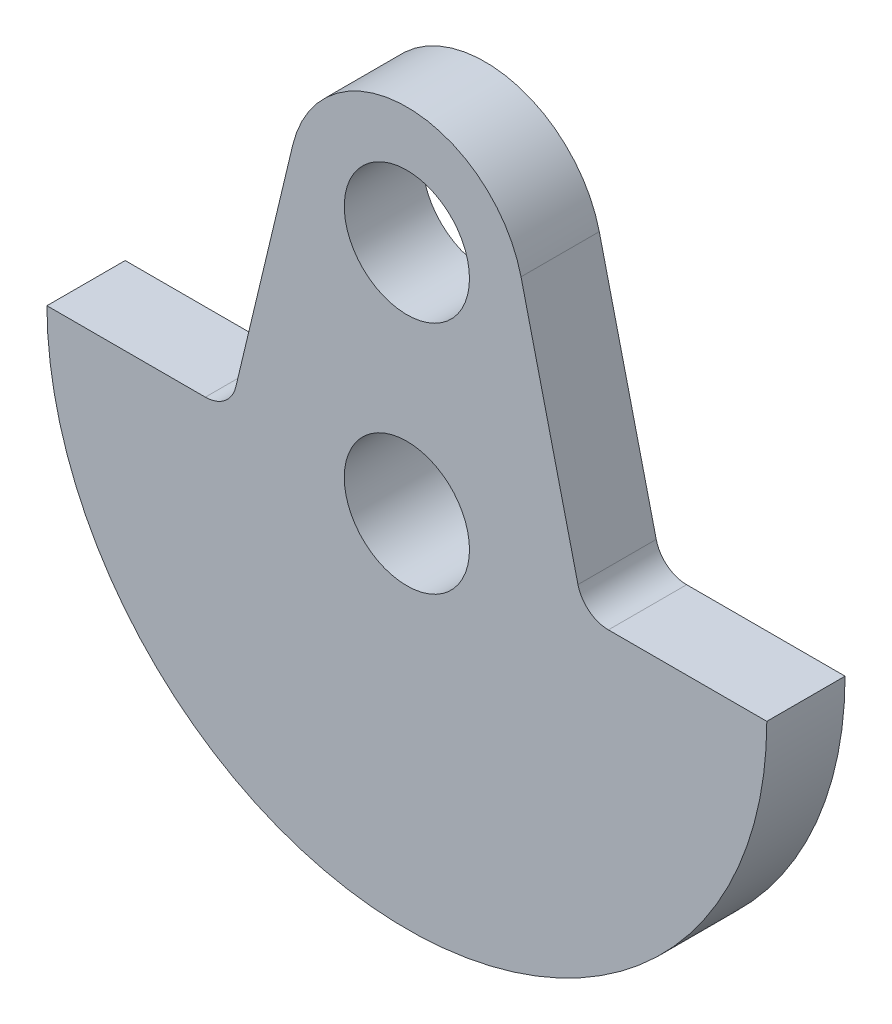
ISO-10303-21;
HEADER;
FILE_DESCRIPTION(('STEP AP214'),'2;1');
FILE_NAME('part.step','',(''),(''),'','','');
FILE_SCHEMA(('AUTOMOTIVE_DESIGN { 1 0 10303 214 1 1 1 1 }'));
ENDSEC;
DATA;
#1=APPLICATION_CONTEXT('core data for automotive mechanical design processes');
#2=APPLICATION_PROTOCOL_DEFINITION('international standard','automotive_design',2000,#1);
#3=PRODUCT_CONTEXT('',#1,'mechanical');
#4=PRODUCT('Part','Part','',(#3));
#5=PRODUCT_RELATED_PRODUCT_CATEGORY('part','',(#4));
#6=PRODUCT_DEFINITION_FORMATION('','',#4);
#7=PRODUCT_DEFINITION_CONTEXT('part definition',#1,'design');
#8=PRODUCT_DEFINITION('design','',#6,#7);
#9=PRODUCT_DEFINITION_SHAPE('','',#8);
#10=(LENGTH_UNIT() NAMED_UNIT(*) SI_UNIT(.MILLI.,.METRE.));
#11=(NAMED_UNIT(*) PLANE_ANGLE_UNIT() SI_UNIT($,.RADIAN.));
#12=(NAMED_UNIT(*) SI_UNIT($,.STERADIAN.) SOLID_ANGLE_UNIT());
#13=UNCERTAINTY_MEASURE_WITH_UNIT(LENGTH_MEASURE(1.E-05),#10,'distance_accuracy_value','');
#14=(GEOMETRIC_REPRESENTATION_CONTEXT(3) GLOBAL_UNCERTAINTY_ASSIGNED_CONTEXT((#13)) GLOBAL_UNIT_ASSIGNED_CONTEXT((#10,
#11,#12)) REPRESENTATION_CONTEXT('',''));
#15=CARTESIAN_POINT('',(0.,0.,0.));
#16=DIRECTION('',(0.,0.,1.));
#17=DIRECTION('',(1.,0.,0.));
#18=AXIS2_PLACEMENT_3D('',#15,#16,#17);
#19=CARTESIAN_POINT('',(12.8779821402295,-13.,0.));
#20=DIRECTION('',(0.,0.,1.));
#21=DIRECTION('',(1.,0.,0.));
#22=AXIS2_PLACEMENT_3D('',#19,#20,#21);
#23=PLANE('',#22);
#24=CARTESIAN_POINT('',(0.,0.,0.));
#25=DIRECTION('',(0.,0.,1.));
#26=DIRECTION('',(1.,0.,0.));
#27=AXIS2_PLACEMENT_3D('',#24,#25,#26);
#28=CIRCLE('',#27,4.);
#29=CARTESIAN_POINT('',(4.,0.,0.));
#30=VERTEX_POINT('',#29);
#31=EDGE_CURVE('E219',#30,#30,#28,.T.);
#32=ORIENTED_EDGE('',*,*,#31,.T.);
#33=EDGE_LOOP('',(#32));
#34=FACE_BOUND('',#33,.T.);
#35=CARTESIAN_POINT('',(12.8779821402295,-13.,0.));
#36=DIRECTION('',(0.,0.,-1.));
#37=DIRECTION('',(1.,0.,0.));
#38=AXIS2_PLACEMENT_3D('',#35,#36,#37);
#39=CIRCLE('',#38,2.);
#40=CARTESIAN_POINT('',(12.8779821402295,-15.,0.));
#41=VERTEX_POINT('',#40);
#42=CARTESIAN_POINT('',(10.9328660587534,-13.4653207813787,0.));
#43=VERTEX_POINT('',#42);
#44=EDGE_CURVE('E147',#41,#43,#39,.T.);
#45=ORIENTED_EDGE('',*,*,#44,.F.);
#46=DIRECTION('',(-1.,0.,0.));
#47=VECTOR('',#46,1.);
#48=CARTESIAN_POINT('',(12.8779821402295,-15.,0.));
#49=LINE('',#48,#47);
#50=CARTESIAN_POINT('',(23.,-15.,0.));
#51=VERTEX_POINT('',#50);
#52=EDGE_CURVE('E96',#51,#41,#49,.T.);
#53=ORIENTED_EDGE('',*,*,#52,.F.);
#54=CARTESIAN_POINT('',(0.,-15.,0.));
#55=DIRECTION('',(0.,0.,1.));
#56=DIRECTION('',(1.,0.,0.));
#57=AXIS2_PLACEMENT_3D('',#54,#55,#56);
#58=CIRCLE('',#57,23.);
#59=CARTESIAN_POINT('',(-23.,-15.,0.));
#60=VERTEX_POINT('',#59);
#61=EDGE_CURVE('E90',#60,#51,#58,.T.);
#62=ORIENTED_EDGE('',*,*,#61,.F.);
#63=DIRECTION('',(-1.,0.,0.));
#64=VECTOR('',#63,1.);
#65=CARTESIAN_POINT('',(-23.,-15.,0.));
#66=LINE('',#65,#64);
#67=CARTESIAN_POINT('',(-12.8779821402295,-15.,0.));
#68=VERTEX_POINT('',#67);
#69=EDGE_CURVE('E134',#68,#60,#66,.T.);
#70=ORIENTED_EDGE('',*,*,#69,.F.);
#71=CARTESIAN_POINT('',(-12.8779821402295,-13.,0.));
#72=DIRECTION('',(0.,0.,-1.));
#73=DIRECTION('',(-1.,0.,0.));
#74=AXIS2_PLACEMENT_3D('',#71,#72,#73);
#75=CIRCLE('',#74,2.);
#76=CARTESIAN_POINT('',(-10.9328660587534,-13.4653207813787,0.));
#77=VERTEX_POINT('',#76);
#78=EDGE_CURVE('E161',#77,#68,#75,.T.);
#79=ORIENTED_EDGE('',*,*,#78,.F.);
#80=DIRECTION('',(-0.232660390689349,-0.972558040738073,0.));
#81=VECTOR('',#80,1.);
#82=CARTESIAN_POINT('',(-10.9328660587534,-13.4653207813787,0.));
#83=LINE('',#82,#81);
#84=CARTESIAN_POINT('',(-7.29418530553555,1.74495293017012,0.));
#85=VERTEX_POINT('',#84);
#86=EDGE_CURVE('E158',#85,#77,#83,.T.);
#87=ORIENTED_EDGE('',*,*,#86,.F.);
#88=CARTESIAN_POINT('',(0.,0.,0.));
#89=DIRECTION('',(0.,0.,1.));
#90=DIRECTION('',(1.,0.,0.));
#91=AXIS2_PLACEMENT_3D('',#88,#89,#90);
#92=CIRCLE('',#91,7.5);
#93=CARTESIAN_POINT('',(7.29418530553555,1.74495293017011,0.));
#94=VERTEX_POINT('',#93);
#95=EDGE_CURVE('E155',#94,#85,#92,.T.);
#96=ORIENTED_EDGE('',*,*,#95,.F.);
#97=DIRECTION('',(-0.232660390689349,0.972558040738073,0.));
#98=VECTOR('',#97,1.);
#99=CARTESIAN_POINT('',(10.9328660587534,-13.4653207813787,0.));
#100=LINE('',#99,#98);
#101=EDGE_CURVE('E151',#43,#94,#100,.T.);
#102=ORIENTED_EDGE('',*,*,#101,.F.);
#103=EDGE_LOOP('',(#45,#53,#62,#70,#79,#87,#96,#102));
#104=FACE_BOUND('',#103,.T.);
#105=CARTESIAN_POINT('',(0.,-15.,0.));
#106=DIRECTION('',(0.,0.,1.));
#107=DIRECTION('',(1.,0.,0.));
#108=AXIS2_PLACEMENT_3D('',#105,#106,#107);
#109=CIRCLE('',#108,6.);
#110=CARTESIAN_POINT('',(6.,-15.,0.));
#111=VERTEX_POINT('',#110);
#112=EDGE_CURVE('E11',#111,#111,#109,.F.);
#113=ORIENTED_EDGE('',*,*,#112,.F.);
#114=EDGE_LOOP('',(#113));
#115=FACE_BOUND('',#114,.T.);
#116=ADVANCED_FACE('F43',(#34,#104,#115),#23,.F.);
#117=CARTESIAN_POINT('',(12.8779821402295,-13.,5.));
#118=DIRECTION('',(0.,0.,1.));
#119=DIRECTION('',(1.,0.,0.));
#120=AXIS2_PLACEMENT_3D('',#117,#118,#119);
#121=PLANE('',#120);
#122=CARTESIAN_POINT('',(0.,0.,5.));
#123=DIRECTION('',(0.,0.,1.));
#124=DIRECTION('',(1.,0.,0.));
#125=AXIS2_PLACEMENT_3D('',#122,#123,#124);
#126=CIRCLE('',#125,4.);
#127=CARTESIAN_POINT('',(4.,0.,5.));
#128=VERTEX_POINT('',#127);
#129=EDGE_CURVE('E152',#128,#128,#126,.T.);
#130=ORIENTED_EDGE('',*,*,#129,.F.);
#131=EDGE_LOOP('',(#130));
#132=FACE_BOUND('',#131,.T.);
#133=CARTESIAN_POINT('',(12.8779821402295,-13.,5.));
#134=DIRECTION('',(0.,0.,-1.));
#135=DIRECTION('',(1.,0.,0.));
#136=AXIS2_PLACEMENT_3D('',#133,#134,#135);
#137=CIRCLE('',#136,2.);
#138=CARTESIAN_POINT('',(12.8779821402295,-15.,5.));
#139=VERTEX_POINT('',#138);
#140=CARTESIAN_POINT('',(10.9328660587534,-13.4653207813787,5.));
#141=VERTEX_POINT('',#140);
#142=EDGE_CURVE('E170',#139,#141,#137,.T.);
#143=ORIENTED_EDGE('',*,*,#142,.T.);
#144=DIRECTION('',(-0.232660390689349,0.972558040738073,0.));
#145=VECTOR('',#144,1.);
#146=CARTESIAN_POINT('',(10.9328660587534,-13.4653207813787,5.));
#147=LINE('',#146,#145);
#148=CARTESIAN_POINT('',(7.29418530553555,1.74495293017011,5.));
#149=VERTEX_POINT('',#148);
#150=EDGE_CURVE('E105',#141,#149,#147,.T.);
#151=ORIENTED_EDGE('',*,*,#150,.T.);
#152=CARTESIAN_POINT('',(0.,0.,5.));
#153=DIRECTION('',(0.,0.,1.));
#154=DIRECTION('',(1.,0.,0.));
#155=AXIS2_PLACEMENT_3D('',#152,#153,#154);
#156=CIRCLE('',#155,7.5);
#157=CARTESIAN_POINT('',(-7.29418530553555,1.74495293017012,5.));
#158=VERTEX_POINT('',#157);
#159=EDGE_CURVE('E209',#149,#158,#156,.T.);
#160=ORIENTED_EDGE('',*,*,#159,.T.);
#161=DIRECTION('',(-0.232660390689349,-0.972558040738073,0.));
#162=VECTOR('',#161,1.);
#163=CARTESIAN_POINT('',(-10.9328660587534,-13.4653207813787,5.));
#164=LINE('',#163,#162);
#165=CARTESIAN_POINT('',(-10.9328660587534,-13.4653207813787,5.));
#166=VERTEX_POINT('',#165);
#167=EDGE_CURVE('E207',#158,#166,#164,.T.);
#168=ORIENTED_EDGE('',*,*,#167,.T.);
#169=CARTESIAN_POINT('',(-12.8779821402295,-13.,5.));
#170=DIRECTION('',(0.,0.,-1.));
#171=DIRECTION('',(-1.,0.,0.));
#172=AXIS2_PLACEMENT_3D('',#169,#170,#171);
#173=CIRCLE('',#172,2.);
#174=CARTESIAN_POINT('',(-12.8779821402295,-15.,5.));
#175=VERTEX_POINT('',#174);
#176=EDGE_CURVE('E125',#166,#175,#173,.T.);
#177=ORIENTED_EDGE('',*,*,#176,.T.);
#178=DIRECTION('',(-1.,0.,0.));
#179=VECTOR('',#178,1.);
#180=CARTESIAN_POINT('',(-23.,-15.,5.));
#181=LINE('',#180,#179);
#182=CARTESIAN_POINT('',(-23.,-15.,5.));
#183=VERTEX_POINT('',#182);
#184=EDGE_CURVE('E118',#175,#183,#181,.T.);
#185=ORIENTED_EDGE('',*,*,#184,.T.);
#186=CARTESIAN_POINT('',(0.,-15.,5.));
#187=DIRECTION('',(0.,0.,1.));
#188=DIRECTION('',(1.,0.,0.));
#189=AXIS2_PLACEMENT_3D('',#186,#187,#188);
#190=CIRCLE('',#189,23.);
#191=CARTESIAN_POINT('',(23.,-15.,5.));
#192=VERTEX_POINT('',#191);
#193=EDGE_CURVE('E123',#183,#192,#190,.T.);
#194=ORIENTED_EDGE('',*,*,#193,.T.);
#195=DIRECTION('',(-1.,0.,0.));
#196=VECTOR('',#195,1.);
#197=CARTESIAN_POINT('',(12.8779821402295,-15.,5.));
#198=LINE('',#197,#196);
#199=EDGE_CURVE('E61',#192,#139,#198,.T.);
#200=ORIENTED_EDGE('',*,*,#199,.T.);
#201=EDGE_LOOP('',(#143,#151,#160,#168,#177,#185,#194,#200));
#202=FACE_BOUND('',#201,.T.);
#203=CARTESIAN_POINT('',(0.,-15.,5.));
#204=DIRECTION('',(0.,0.,1.));
#205=DIRECTION('',(1.,0.,0.));
#206=AXIS2_PLACEMENT_3D('',#203,#204,#205);
#207=CIRCLE('',#206,4.);
#208=CARTESIAN_POINT('',(4.,-15.,5.));
#209=VERTEX_POINT('',#208);
#210=EDGE_CURVE('E223',#209,#209,#207,.T.);
#211=ORIENTED_EDGE('',*,*,#210,.F.);
#212=EDGE_LOOP('',(#211));
#213=FACE_BOUND('',#212,.T.);
#214=ADVANCED_FACE('F120',(#132,#202,#213),#121,.T.);
#215=CARTESIAN_POINT('',(12.8779821402295,-13.,5.));
#216=DIRECTION('',(0.,0.,-1.));
#217=DIRECTION('',(-1.,0.,0.));
#218=AXIS2_PLACEMENT_3D('',#215,#216,#217);
#219=CYLINDRICAL_SURFACE('',#218,2.);
#220=ORIENTED_EDGE('',*,*,#44,.T.);
#221=DIRECTION('',(0.,0.,-1.));
#222=VECTOR('',#221,1.);
#223=CARTESIAN_POINT('',(10.9328660587534,-13.4653207813787,5.));
#224=LINE('',#223,#222);
#225=EDGE_CURVE('E53',#141,#43,#224,.T.);
#226=ORIENTED_EDGE('',*,*,#225,.F.);
#227=ORIENTED_EDGE('',*,*,#142,.F.);
#228=DIRECTION('',(0.,0.,-1.));
#229=VECTOR('',#228,1.);
#230=CARTESIAN_POINT('',(12.8779821402295,-15.,5.));
#231=LINE('',#230,#229);
#232=EDGE_CURVE('E143',#139,#41,#231,.T.);
#233=ORIENTED_EDGE('',*,*,#232,.T.);
#234=EDGE_LOOP('',(#220,#226,#227,#233));
#235=FACE_BOUND('',#234,.T.);
#236=ADVANCED_FACE('F45',(#235),#219,.F.);
#237=CARTESIAN_POINT('',(10.9328660587534,-13.4653207813787,5.));
#238=DIRECTION('',(-0.972558040738073,-0.232660390689349,0.));
#239=DIRECTION('',(0.232660390689349,-0.972558040738073,0.));
#240=AXIS2_PLACEMENT_3D('',#237,#238,#239);
#241=PLANE('',#240);
#242=ORIENTED_EDGE('',*,*,#101,.T.);
#243=DIRECTION('',(0.,0.,-1.));
#244=VECTOR('',#243,1.);
#245=CARTESIAN_POINT('',(7.29418530553555,1.74495293017011,5.));
#246=LINE('',#245,#244);
#247=EDGE_CURVE('E185',#149,#94,#246,.T.);
#248=ORIENTED_EDGE('',*,*,#247,.F.);
#249=ORIENTED_EDGE('',*,*,#150,.F.);
#250=ORIENTED_EDGE('',*,*,#225,.T.);
#251=EDGE_LOOP('',(#242,#248,#249,#250));
#252=FACE_BOUND('',#251,.T.);
#253=ADVANCED_FACE('F190',(#252),#241,.F.);
#254=CARTESIAN_POINT('',(0.,0.,5.));
#255=DIRECTION('',(0.,0.,-1.));
#256=DIRECTION('',(-1.,0.,0.));
#257=AXIS2_PLACEMENT_3D('',#254,#255,#256);
#258=CYLINDRICAL_SURFACE('',#257,7.5);
#259=ORIENTED_EDGE('',*,*,#95,.T.);
#260=DIRECTION('',(0.,0.,-1.));
#261=VECTOR('',#260,1.);
#262=CARTESIAN_POINT('',(-7.29418530553555,1.74495293017012,5.));
#263=LINE('',#262,#261);
#264=EDGE_CURVE('E181',#158,#85,#263,.T.);
#265=ORIENTED_EDGE('',*,*,#264,.F.);
#266=ORIENTED_EDGE('',*,*,#159,.F.);
#267=ORIENTED_EDGE('',*,*,#247,.T.);
#268=EDGE_LOOP('',(#259,#265,#266,#267));
#269=FACE_BOUND('',#268,.T.);
#270=ADVANCED_FACE('F201',(#269),#258,.T.);
#271=CARTESIAN_POINT('',(-10.9328660587534,-13.4653207813787,5.));
#272=DIRECTION('',(0.972558040738073,-0.232660390689349,0.));
#273=DIRECTION('',(0.232660390689349,0.972558040738073,0.));
#274=AXIS2_PLACEMENT_3D('',#271,#272,#273);
#275=PLANE('',#274);
#276=ORIENTED_EDGE('',*,*,#86,.T.);
#277=DIRECTION('',(0.,0.,-1.));
#278=VECTOR('',#277,1.);
#279=CARTESIAN_POINT('',(-10.9328660587534,-13.4653207813787,5.));
#280=LINE('',#279,#278);
#281=EDGE_CURVE('E177',#166,#77,#280,.T.);
#282=ORIENTED_EDGE('',*,*,#281,.F.);
#283=ORIENTED_EDGE('',*,*,#167,.F.);
#284=ORIENTED_EDGE('',*,*,#264,.T.);
#285=EDGE_LOOP('',(#276,#282,#283,#284));
#286=FACE_BOUND('',#285,.T.);
#287=ADVANCED_FACE('F205',(#286),#275,.F.);
#288=CARTESIAN_POINT('',(-12.8779821402295,-13.,5.));
#289=DIRECTION('',(0.,0.,-1.));
#290=DIRECTION('',(-1.,0.,0.));
#291=AXIS2_PLACEMENT_3D('',#288,#289,#290);
#292=CYLINDRICAL_SURFACE('',#291,2.);
#293=ORIENTED_EDGE('',*,*,#78,.T.);
#294=DIRECTION('',(0.,0.,-1.));
#295=VECTOR('',#294,1.);
#296=CARTESIAN_POINT('',(-12.8779821402295,-15.,5.));
#297=LINE('',#296,#295);
#298=EDGE_CURVE('E136',#175,#68,#297,.T.);
#299=ORIENTED_EDGE('',*,*,#298,.F.);
#300=ORIENTED_EDGE('',*,*,#176,.F.);
#301=ORIENTED_EDGE('',*,*,#281,.T.);
#302=EDGE_LOOP('',(#293,#299,#300,#301));
#303=FACE_BOUND('',#302,.T.);
#304=ADVANCED_FACE('F272',(#303),#292,.F.);
#305=CARTESIAN_POINT('',(-23.,-15.,5.));
#306=DIRECTION('',(0.,-1.,0.));
#307=DIRECTION('',(0.,0.,-1.));
#308=AXIS2_PLACEMENT_3D('',#305,#306,#307);
#309=PLANE('',#308);
#310=ORIENTED_EDGE('',*,*,#69,.T.);
#311=DIRECTION('',(0.,0.,-1.));
#312=VECTOR('',#311,1.);
#313=CARTESIAN_POINT('',(-23.,-15.,5.));
#314=LINE('',#313,#312);
#315=EDGE_CURVE('E131',#183,#60,#314,.T.);
#316=ORIENTED_EDGE('',*,*,#315,.F.);
#317=ORIENTED_EDGE('',*,*,#184,.F.);
#318=ORIENTED_EDGE('',*,*,#298,.T.);
#319=EDGE_LOOP('',(#310,#316,#317,#318));
#320=FACE_BOUND('',#319,.T.);
#321=ADVANCED_FACE('F132',(#320),#309,.F.);
#322=CARTESIAN_POINT('',(0.,-15.,5.));
#323=DIRECTION('',(0.,0.,-1.));
#324=DIRECTION('',(-1.,0.,0.));
#325=AXIS2_PLACEMENT_3D('',#322,#323,#324);
#326=CYLINDRICAL_SURFACE('',#325,23.);
#327=ORIENTED_EDGE('',*,*,#61,.T.);
#328=DIRECTION('',(0.,0.,-1.));
#329=VECTOR('',#328,1.);
#330=CARTESIAN_POINT('',(23.,-15.,5.));
#331=LINE('',#330,#329);
#332=EDGE_CURVE('E137',#192,#51,#331,.T.);
#333=ORIENTED_EDGE('',*,*,#332,.F.);
#334=ORIENTED_EDGE('',*,*,#193,.F.);
#335=ORIENTED_EDGE('',*,*,#315,.T.);
#336=EDGE_LOOP('',(#327,#333,#334,#335));
#337=FACE_BOUND('',#336,.T.);
#338=ADVANCED_FACE('F139',(#337),#326,.T.);
#339=CARTESIAN_POINT('',(12.8779821402295,-15.,5.));
#340=DIRECTION('',(0.,-1.,0.));
#341=DIRECTION('',(0.,0.,-1.));
#342=AXIS2_PLACEMENT_3D('',#339,#340,#341);
#343=PLANE('',#342);
#344=ORIENTED_EDGE('',*,*,#52,.T.);
#345=ORIENTED_EDGE('',*,*,#232,.F.);
#346=ORIENTED_EDGE('',*,*,#199,.F.);
#347=ORIENTED_EDGE('',*,*,#332,.T.);
#348=EDGE_LOOP('',(#344,#345,#346,#347));
#349=FACE_BOUND('',#348,.T.);
#350=ADVANCED_FACE('F265',(#349),#343,.F.);
#351=CARTESIAN_POINT('',(0.,0.,5.));
#352=DIRECTION('',(0.,0.,-1.));
#353=DIRECTION('',(-1.,0.,0.));
#354=AXIS2_PLACEMENT_3D('',#351,#352,#353);
#355=CYLINDRICAL_SURFACE('',#354,4.);
#356=ORIENTED_EDGE('',*,*,#129,.T.);
#357=EDGE_LOOP('',(#356));
#358=FACE_BOUND('',#357,.T.);
#359=ORIENTED_EDGE('',*,*,#31,.F.);
#360=EDGE_LOOP('',(#359));
#361=FACE_BOUND('',#360,.T.);
#362=ADVANCED_FACE('F252',(#358,#361),#355,.F.);
#363=CARTESIAN_POINT('',(0.,-15.,5.));
#364=DIRECTION('',(0.,0.,-1.));
#365=DIRECTION('',(-1.,0.,0.));
#366=AXIS2_PLACEMENT_3D('',#363,#364,#365);
#367=CYLINDRICAL_SURFACE('',#366,4.);
#368=ORIENTED_EDGE('',*,*,#210,.T.);
#369=EDGE_LOOP('',(#368));
#370=FACE_BOUND('',#369,.T.);
#371=CARTESIAN_POINT('',(0.,-15.,-1.));
#372=DIRECTION('',(0.,0.,-1.));
#373=DIRECTION('',(-1.,0.,0.));
#374=AXIS2_PLACEMENT_3D('',#371,#372,#373);
#375=CIRCLE('',#374,4.);
#376=CARTESIAN_POINT('',(-4.,-15.,-1.));
#377=VERTEX_POINT('',#376);
#378=EDGE_CURVE('E234',#377,#377,#375,.T.);
#379=ORIENTED_EDGE('',*,*,#378,.T.);
#380=EDGE_LOOP('',(#379));
#381=FACE_BOUND('',#380,.T.);
#382=ADVANCED_FACE('F239',(#370,#381),#367,.F.);
#383=CARTESIAN_POINT('',(0.,-15.,-1.));
#384=DIRECTION('',(0.,0.,-1.));
#385=DIRECTION('',(-1.,0.,0.));
#386=AXIS2_PLACEMENT_3D('',#383,#384,#385);
#387=PLANE('',#386);
#388=CARTESIAN_POINT('',(0.,-15.,-1.));
#389=DIRECTION('',(0.,0.,-1.));
#390=DIRECTION('',(-1.,0.,0.));
#391=AXIS2_PLACEMENT_3D('',#388,#389,#390);
#392=CIRCLE('',#391,6.);
#393=CARTESIAN_POINT('',(-6.,-15.,-1.));
#394=VERTEX_POINT('',#393);
#395=EDGE_CURVE('E230',#394,#394,#392,.T.);
#396=ORIENTED_EDGE('',*,*,#395,.T.);
#397=EDGE_LOOP('',(#396));
#398=FACE_BOUND('',#397,.T.);
#399=ORIENTED_EDGE('',*,*,#378,.F.);
#400=EDGE_LOOP('',(#399));
#401=FACE_BOUND('',#400,.T.);
#402=ADVANCED_FACE('F241',(#398,#401),#387,.T.);
#403=CARTESIAN_POINT('',(0.,-15.,-1.));
#404=DIRECTION('',(0.,0.,1.));
#405=DIRECTION('',(1.,0.,0.));
#406=AXIS2_PLACEMENT_3D('',#403,#404,#405);
#407=CYLINDRICAL_SURFACE('',#406,6.);
#408=ORIENTED_EDGE('',*,*,#395,.F.);
#409=EDGE_LOOP('',(#408));
#410=FACE_BOUND('',#409,.T.);
#411=ORIENTED_EDGE('',*,*,#112,.T.);
#412=EDGE_LOOP('',(#411));
#413=FACE_BOUND('',#412,.T.);
#414=ADVANCED_FACE('F243',(#410,#413),#407,.T.);
#415=CLOSED_SHELL('',(#116,#214,#236,#253,#270,#287,#304,#321,#338,#350,#362,#382,#402,#414));
#416=MANIFOLD_SOLID_BREP('B2',#415);
#417=ADVANCED_BREP_SHAPE_REPRESENTATION('',(#18,#416),#14);
#418=SHAPE_DEFINITION_REPRESENTATION(#9,#417);
ENDSEC;
END-ISO-10303-21;
